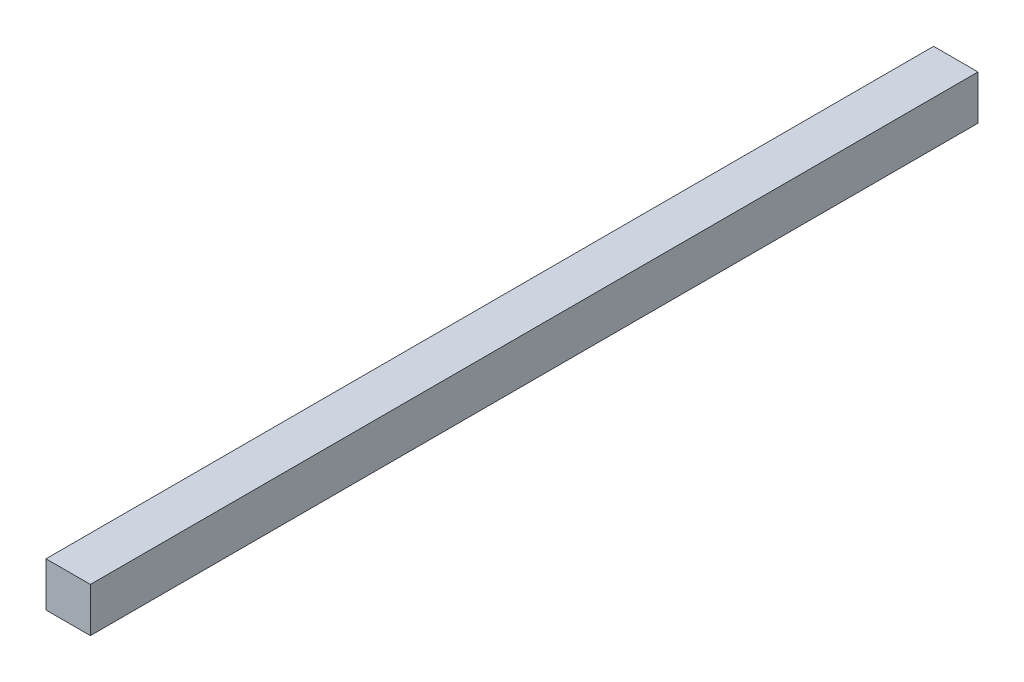
ISO-10303-21;
HEADER;
FILE_DESCRIPTION(('STEP AP214'),'2;1');
FILE_NAME('part.step','',(''),(''),'','','');
FILE_SCHEMA(('AUTOMOTIVE_DESIGN { 1 0 10303 214 1 1 1 1 }'));
ENDSEC;
DATA;
#1=APPLICATION_CONTEXT('core data for automotive mechanical design processes');
#2=APPLICATION_PROTOCOL_DEFINITION('international standard','automotive_design',2000,#1);
#3=PRODUCT_CONTEXT('',#1,'mechanical');
#4=PRODUCT('Part','Part','',(#3));
#5=PRODUCT_RELATED_PRODUCT_CATEGORY('part','',(#4));
#6=PRODUCT_DEFINITION_FORMATION('','',#4);
#7=PRODUCT_DEFINITION_CONTEXT('part definition',#1,'design');
#8=PRODUCT_DEFINITION('design','',#6,#7);
#9=PRODUCT_DEFINITION_SHAPE('','',#8);
#10=(LENGTH_UNIT() NAMED_UNIT(*) SI_UNIT(.MILLI.,.METRE.));
#11=(NAMED_UNIT(*) PLANE_ANGLE_UNIT() SI_UNIT($,.RADIAN.));
#12=(NAMED_UNIT(*) SI_UNIT($,.STERADIAN.) SOLID_ANGLE_UNIT());
#13=UNCERTAINTY_MEASURE_WITH_UNIT(LENGTH_MEASURE(1.E-05),#10,'distance_accuracy_value','');
#14=(GEOMETRIC_REPRESENTATION_CONTEXT(3) GLOBAL_UNCERTAINTY_ASSIGNED_CONTEXT((#13)) GLOBAL_UNIT_ASSIGNED_CONTEXT((#10,
#11,#12)) REPRESENTATION_CONTEXT('',''));
#15=CARTESIAN_POINT('',(0.,0.,0.));
#16=DIRECTION('',(0.,0.,1.));
#17=DIRECTION('',(1.,0.,0.));
#18=AXIS2_PLACEMENT_3D('',#15,#16,#17);
#19=CARTESIAN_POINT('',(0.,0.,-508.));
#20=DIRECTION('',(-1.,0.,0.));
#21=DIRECTION('',(0.,0.,1.));
#22=AXIS2_PLACEMENT_3D('',#19,#20,#21);
#23=PLANE('',#22);
#24=DIRECTION('',(0.,-1.,0.));
#25=VECTOR('',#24,1.);
#26=CARTESIAN_POINT('',(0.,0.,0.));
#27=LINE('',#26,#25);
#28=CARTESIAN_POINT('',(0.,25.4,0.));
#29=VERTEX_POINT('',#28);
#30=CARTESIAN_POINT('',(0.,0.,0.));
#31=VERTEX_POINT('',#30);
#32=EDGE_CURVE('E80',#29,#31,#27,.T.);
#33=ORIENTED_EDGE('',*,*,#32,.F.);
#34=DIRECTION('',(0.,0.,1.));
#35=VECTOR('',#34,1.);
#36=CARTESIAN_POINT('',(0.,25.4,-508.));
#37=LINE('',#36,#35);
#38=CARTESIAN_POINT('',(0.,25.4,-508.));
#39=VERTEX_POINT('',#38);
#40=EDGE_CURVE('E11',#39,#29,#37,.T.);
#41=ORIENTED_EDGE('',*,*,#40,.F.);
#42=DIRECTION('',(0.,-1.,0.));
#43=VECTOR('',#42,1.);
#44=CARTESIAN_POINT('',(0.,0.,-508.));
#45=LINE('',#44,#43);
#46=CARTESIAN_POINT('',(0.,0.,-508.));
#47=VERTEX_POINT('',#46);
#48=EDGE_CURVE('E82',#39,#47,#45,.T.);
#49=ORIENTED_EDGE('',*,*,#48,.T.);
#50=DIRECTION('',(0.,0.,1.));
#51=VECTOR('',#50,1.);
#52=CARTESIAN_POINT('',(0.,0.,-508.));
#53=LINE('',#52,#51);
#54=EDGE_CURVE('E43',#47,#31,#53,.T.);
#55=ORIENTED_EDGE('',*,*,#54,.T.);
#56=EDGE_LOOP('',(#33,#41,#49,#55));
#57=FACE_BOUND('',#56,.T.);
#58=ADVANCED_FACE('F40',(#57),#23,.T.);
#59=CARTESIAN_POINT('',(0.,25.4,-508.));
#60=DIRECTION('',(0.,1.,0.));
#61=DIRECTION('',(0.,0.,1.));
#62=AXIS2_PLACEMENT_3D('',#59,#60,#61);
#63=PLANE('',#62);
#64=DIRECTION('',(-1.,0.,0.));
#65=VECTOR('',#64,1.);
#66=CARTESIAN_POINT('',(0.,25.4,0.));
#67=LINE('',#66,#65);
#68=CARTESIAN_POINT('',(25.4,25.4,0.));
#69=VERTEX_POINT('',#68);
#70=EDGE_CURVE('E97',#69,#29,#67,.T.);
#71=ORIENTED_EDGE('',*,*,#70,.F.);
#72=DIRECTION('',(0.,0.,1.));
#73=VECTOR('',#72,1.);
#74=CARTESIAN_POINT('',(25.4,25.4,-508.));
#75=LINE('',#74,#73);
#76=CARTESIAN_POINT('',(25.4,25.4,-508.));
#77=VERTEX_POINT('',#76);
#78=EDGE_CURVE('E48',#77,#69,#75,.T.);
#79=ORIENTED_EDGE('',*,*,#78,.F.);
#80=DIRECTION('',(-1.,0.,0.));
#81=VECTOR('',#80,1.);
#82=CARTESIAN_POINT('',(0.,25.4,-508.));
#83=LINE('',#82,#81);
#84=EDGE_CURVE('E87',#77,#39,#83,.T.);
#85=ORIENTED_EDGE('',*,*,#84,.T.);
#86=ORIENTED_EDGE('',*,*,#40,.T.);
#87=EDGE_LOOP('',(#71,#79,#85,#86));
#88=FACE_BOUND('',#87,.T.);
#89=ADVANCED_FACE('F112',(#88),#63,.T.);
#90=CARTESIAN_POINT('',(25.4,0.,-508.));
#91=DIRECTION('',(1.,0.,0.));
#92=DIRECTION('',(0.,0.,-1.));
#93=AXIS2_PLACEMENT_3D('',#90,#91,#92);
#94=PLANE('',#93);
#95=DIRECTION('',(0.,1.,0.));
#96=VECTOR('',#95,1.);
#97=CARTESIAN_POINT('',(25.4,0.,0.));
#98=LINE('',#97,#96);
#99=CARTESIAN_POINT('',(25.4,0.,0.));
#100=VERTEX_POINT('',#99);
#101=EDGE_CURVE('E94',#100,#69,#98,.T.);
#102=ORIENTED_EDGE('',*,*,#101,.F.);
#103=DIRECTION('',(0.,0.,1.));
#104=VECTOR('',#103,1.);
#105=CARTESIAN_POINT('',(25.4,0.,-508.));
#106=LINE('',#105,#104);
#107=CARTESIAN_POINT('',(25.4,0.,-508.));
#108=VERTEX_POINT('',#107);
#109=EDGE_CURVE('E86',#108,#100,#106,.T.);
#110=ORIENTED_EDGE('',*,*,#109,.F.);
#111=DIRECTION('',(0.,1.,0.));
#112=VECTOR('',#111,1.);
#113=CARTESIAN_POINT('',(25.4,0.,-508.));
#114=LINE('',#113,#112);
#115=EDGE_CURVE('E105',#108,#77,#114,.T.);
#116=ORIENTED_EDGE('',*,*,#115,.T.);
#117=ORIENTED_EDGE('',*,*,#78,.T.);
#118=EDGE_LOOP('',(#102,#110,#116,#117));
#119=FACE_BOUND('',#118,.T.);
#120=ADVANCED_FACE('F109',(#119),#94,.T.);
#121=CARTESIAN_POINT('',(0.,0.,-508.));
#122=DIRECTION('',(0.,-1.,0.));
#123=DIRECTION('',(0.,0.,-1.));
#124=AXIS2_PLACEMENT_3D('',#121,#122,#123);
#125=PLANE('',#124);
#126=DIRECTION('',(1.,0.,0.));
#127=VECTOR('',#126,1.);
#128=CARTESIAN_POINT('',(0.,0.,0.));
#129=LINE('',#128,#127);
#130=EDGE_CURVE('E89',#31,#100,#129,.T.);
#131=ORIENTED_EDGE('',*,*,#130,.F.);
#132=ORIENTED_EDGE('',*,*,#54,.F.);
#133=DIRECTION('',(1.,0.,0.));
#134=VECTOR('',#133,1.);
#135=CARTESIAN_POINT('',(0.,0.,-508.));
#136=LINE('',#135,#134);
#137=EDGE_CURVE('E103',#47,#108,#136,.T.);
#138=ORIENTED_EDGE('',*,*,#137,.T.);
#139=ORIENTED_EDGE('',*,*,#109,.T.);
#140=EDGE_LOOP('',(#131,#132,#138,#139));
#141=FACE_BOUND('',#140,.T.);
#142=ADVANCED_FACE('F90',(#141),#125,.T.);
#143=CARTESIAN_POINT('',(0.,25.4,-508.));
#144=DIRECTION('',(0.,0.,-1.));
#145=DIRECTION('',(-1.,0.,0.));
#146=AXIS2_PLACEMENT_3D('',#143,#144,#145);
#147=PLANE('',#146);
#148=ORIENTED_EDGE('',*,*,#48,.F.);
#149=ORIENTED_EDGE('',*,*,#84,.F.);
#150=ORIENTED_EDGE('',*,*,#115,.F.);
#151=ORIENTED_EDGE('',*,*,#137,.F.);
#152=EDGE_LOOP('',(#148,#149,#150,#151));
#153=FACE_BOUND('',#152,.T.);
#154=ADVANCED_FACE('F114',(#153),#147,.T.);
#155=CARTESIAN_POINT('',(0.,25.4,0.));
#156=DIRECTION('',(0.,0.,-1.));
#157=DIRECTION('',(-1.,0.,0.));
#158=AXIS2_PLACEMENT_3D('',#155,#156,#157);
#159=PLANE('',#158);
#160=ORIENTED_EDGE('',*,*,#32,.T.);
#161=ORIENTED_EDGE('',*,*,#130,.T.);
#162=ORIENTED_EDGE('',*,*,#101,.T.);
#163=ORIENTED_EDGE('',*,*,#70,.T.);
#164=EDGE_LOOP('',(#160,#161,#162,#163));
#165=FACE_BOUND('',#164,.T.);
#166=ADVANCED_FACE('F96',(#165),#159,.F.);
#167=CLOSED_SHELL('',(#58,#89,#120,#142,#154,#166));
#168=MANIFOLD_SOLID_BREP('B2',#167);
#169=ADVANCED_BREP_SHAPE_REPRESENTATION('',(#18,#168),#14);
#170=SHAPE_DEFINITION_REPRESENTATION(#9,#169);
ENDSEC;
END-ISO-10303-21;
